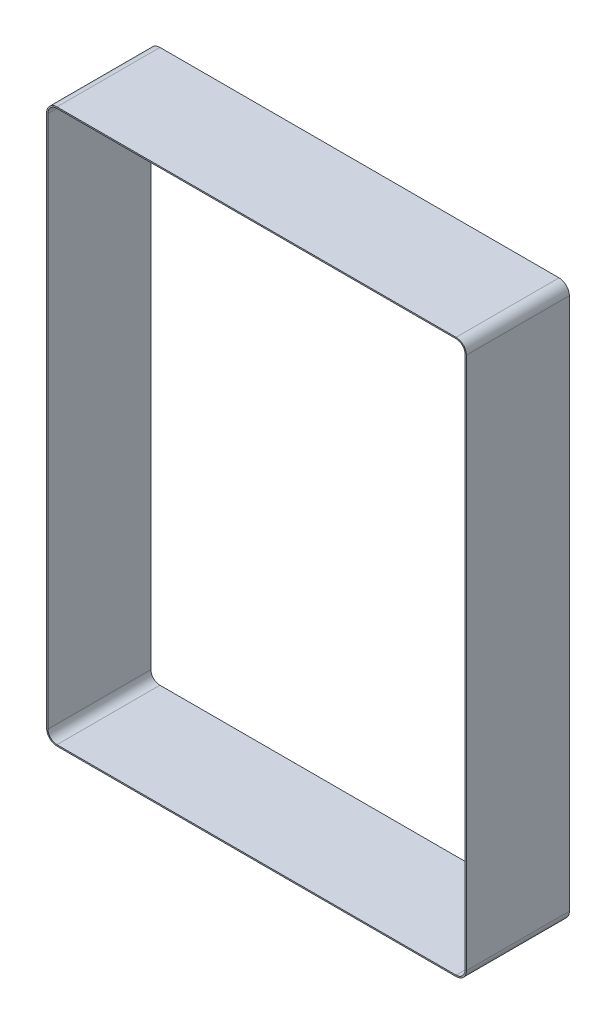
ISO-10303-21;
HEADER;
FILE_DESCRIPTION(('STEP AP214'),'2;1');
FILE_NAME('part.step','',(''),(''),'','','');
FILE_SCHEMA(('AUTOMOTIVE_DESIGN { 1 0 10303 214 1 1 1 1 }'));
ENDSEC;
DATA;
#1=APPLICATION_CONTEXT('core data for automotive mechanical design processes');
#2=APPLICATION_PROTOCOL_DEFINITION('international standard','automotive_design',2000,#1);
#3=PRODUCT_CONTEXT('',#1,'mechanical');
#4=PRODUCT('Part','Part','',(#3));
#5=PRODUCT_RELATED_PRODUCT_CATEGORY('part','',(#4));
#6=PRODUCT_DEFINITION_FORMATION('','',#4);
#7=PRODUCT_DEFINITION_CONTEXT('part definition',#1,'design');
#8=PRODUCT_DEFINITION('design','',#6,#7);
#9=PRODUCT_DEFINITION_SHAPE('','',#8);
#10=(LENGTH_UNIT() NAMED_UNIT(*) SI_UNIT(.MILLI.,.METRE.));
#11=(NAMED_UNIT(*) PLANE_ANGLE_UNIT() SI_UNIT($,.RADIAN.));
#12=(NAMED_UNIT(*) SI_UNIT($,.STERADIAN.) SOLID_ANGLE_UNIT());
#13=UNCERTAINTY_MEASURE_WITH_UNIT(LENGTH_MEASURE(1.E-05),#10,'distance_accuracy_value','');
#14=(GEOMETRIC_REPRESENTATION_CONTEXT(3) GLOBAL_UNCERTAINTY_ASSIGNED_CONTEXT((#13)) GLOBAL_UNIT_ASSIGNED_CONTEXT((#10,
#11,#12)) REPRESENTATION_CONTEXT('',''));
#15=CARTESIAN_POINT('',(0.,0.,0.));
#16=DIRECTION('',(0.,0.,1.));
#17=DIRECTION('',(1.,0.,0.));
#18=AXIS2_PLACEMENT_3D('',#15,#16,#17);
#19=CARTESIAN_POINT('',(-154.999999999862,-26.2767905550758,80.));
#20=DIRECTION('',(0.,0.,-1.));
#21=DIRECTION('',(-1.,0.,0.));
#22=AXIS2_PLACEMENT_3D('',#19,#20,#21);
#23=CYLINDRICAL_SURFACE('',#22,6.99999999999989);
#24=CARTESIAN_POINT('',(-154.999999999862,-26.2767905550758,0.));
#25=DIRECTION('',(0.,0.,1.));
#26=DIRECTION('',(1.,0.,0.));
#27=AXIS2_PLACEMENT_3D('',#24,#25,#26);
#28=CIRCLE('',#27,6.99999999999989);
#29=CARTESIAN_POINT('',(-161.999999999862,-26.2767905550758,0.));
#30=VERTEX_POINT('',#29);
#31=CARTESIAN_POINT('',(-154.999999999862,-33.2767905550757,0.));
#32=VERTEX_POINT('',#31);
#33=EDGE_CURVE('E211',#30,#32,#28,.T.);
#34=ORIENTED_EDGE('',*,*,#33,.F.);
#35=DIRECTION('',(0.,0.,-1.));
#36=VECTOR('',#35,1.);
#37=CARTESIAN_POINT('',(-161.999999999862,-26.2767905550758,80.));
#38=LINE('',#37,#36);
#39=CARTESIAN_POINT('',(-161.999999999862,-26.2767905550758,80.));
#40=VERTEX_POINT('',#39);
#41=EDGE_CURVE('E11',#40,#30,#38,.T.);
#42=ORIENTED_EDGE('',*,*,#41,.F.);
#43=CARTESIAN_POINT('',(-154.999999999862,-26.2767905550758,80.));
#44=DIRECTION('',(0.,0.,1.));
#45=DIRECTION('',(1.,0.,0.));
#46=AXIS2_PLACEMENT_3D('',#43,#44,#45);
#47=CIRCLE('',#46,6.99999999999989);
#48=CARTESIAN_POINT('',(-154.999999999862,-33.2767905550757,80.));
#49=VERTEX_POINT('',#48);
#50=EDGE_CURVE('E303',#40,#49,#47,.T.);
#51=ORIENTED_EDGE('',*,*,#50,.T.);
#52=DIRECTION('',(0.,0.,-1.));
#53=VECTOR('',#52,1.);
#54=CARTESIAN_POINT('',(-154.999999999862,-33.2767905550757,80.));
#55=LINE('',#54,#53);
#56=EDGE_CURVE('E113',#49,#32,#55,.T.);
#57=ORIENTED_EDGE('',*,*,#56,.T.);
#58=EDGE_LOOP('',(#34,#42,#51,#57));
#59=FACE_BOUND('',#58,.T.);
#60=ADVANCED_FACE('F35',(#59),#23,.F.);
#61=CARTESIAN_POINT('',(-161.999999999862,0.,80.));
#62=DIRECTION('',(-1.,0.,0.));
#63=DIRECTION('',(0.,-1.,0.));
#64=AXIS2_PLACEMENT_3D('',#61,#62,#63);
#65=PLANE('',#64);
#66=DIRECTION('',(0.,1.,0.));
#67=VECTOR('',#66,1.);
#68=CARTESIAN_POINT('',(-161.999999999862,0.,0.));
#69=LINE('',#68,#67);
#70=CARTESIAN_POINT('',(-161.999999999862,387.723209444924,0.));
#71=VERTEX_POINT('',#70);
#72=EDGE_CURVE('E213',#30,#71,#69,.T.);
#73=ORIENTED_EDGE('',*,*,#72,.T.);
#74=DIRECTION('',(0.,0.,-1.));
#75=VECTOR('',#74,1.);
#76=CARTESIAN_POINT('',(-161.999999999862,387.723209444924,80.));
#77=LINE('',#76,#75);
#78=CARTESIAN_POINT('',(-161.999999999862,387.723209444924,80.));
#79=VERTEX_POINT('',#78);
#80=EDGE_CURVE('E45',#79,#71,#77,.T.);
#81=ORIENTED_EDGE('',*,*,#80,.F.);
#82=DIRECTION('',(0.,1.,0.));
#83=VECTOR('',#82,1.);
#84=CARTESIAN_POINT('',(-161.999999999862,0.,80.));
#85=LINE('',#84,#83);
#86=EDGE_CURVE('E305',#40,#79,#85,.T.);
#87=ORIENTED_EDGE('',*,*,#86,.F.);
#88=ORIENTED_EDGE('',*,*,#41,.T.);
#89=EDGE_LOOP('',(#73,#81,#87,#88));
#90=FACE_BOUND('',#89,.T.);
#91=ADVANCED_FACE('F332',(#90),#65,.F.);
#92=CARTESIAN_POINT('',(-155.000000000136,387.723209444924,80.));
#93=DIRECTION('',(0.,0.,-1.));
#94=DIRECTION('',(-1.,0.,0.));
#95=AXIS2_PLACEMENT_3D('',#92,#93,#94);
#96=CYLINDRICAL_SURFACE('',#95,6.99999999986282);
#97=CARTESIAN_POINT('',(-155.000000000136,387.723209444924,0.));
#98=DIRECTION('',(0.,0.,1.));
#99=DIRECTION('',(1.,0.,0.));
#100=AXIS2_PLACEMENT_3D('',#97,#98,#99);
#101=CIRCLE('',#100,6.99999999986282);
#102=CARTESIAN_POINT('',(-154.999999999695,394.723209444924,0.));
#103=VERTEX_POINT('',#102);
#104=EDGE_CURVE('E216',#103,#71,#101,.T.);
#105=ORIENTED_EDGE('',*,*,#104,.F.);
#106=DIRECTION('',(0.,0.,-1.));
#107=VECTOR('',#106,1.);
#108=CARTESIAN_POINT('',(-154.999999999695,394.723209444924,80.));
#109=LINE('',#108,#107);
#110=CARTESIAN_POINT('',(-154.999999999695,394.723209444924,80.));
#111=VERTEX_POINT('',#110);
#112=EDGE_CURVE('E235',#111,#103,#109,.T.);
#113=ORIENTED_EDGE('',*,*,#112,.F.);
#114=CARTESIAN_POINT('',(-155.000000000136,387.723209444924,80.));
#115=DIRECTION('',(0.,0.,1.));
#116=DIRECTION('',(1.,0.,0.));
#117=AXIS2_PLACEMENT_3D('',#114,#115,#116);
#118=CIRCLE('',#117,6.99999999986282);
#119=EDGE_CURVE('E307',#111,#79,#118,.T.);
#120=ORIENTED_EDGE('',*,*,#119,.T.);
#121=ORIENTED_EDGE('',*,*,#80,.T.);
#122=EDGE_LOOP('',(#105,#113,#120,#121));
#123=FACE_BOUND('',#122,.T.);
#124=ADVANCED_FACE('F318',(#123),#96,.F.);
#125=CARTESIAN_POINT('',(0.,394.723209444924,80.));
#126=DIRECTION('',(0.,-1.,0.));
#127=DIRECTION('',(1.,0.,0.));
#128=AXIS2_PLACEMENT_3D('',#125,#126,#127);
#129=PLANE('',#128);
#130=DIRECTION('',(-1.,0.,0.));
#131=VECTOR('',#130,1.);
#132=CARTESIAN_POINT('',(0.,394.723209444924,0.));
#133=LINE('',#132,#131);
#134=CARTESIAN_POINT('',(154.999999999694,394.723209444924,0.));
#135=VERTEX_POINT('',#134);
#136=EDGE_CURVE('E219',#135,#103,#133,.T.);
#137=ORIENTED_EDGE('',*,*,#136,.F.);
#138=DIRECTION('',(0.,0.,-1.));
#139=VECTOR('',#138,1.);
#140=CARTESIAN_POINT('',(154.999999999694,394.723209444924,80.));
#141=LINE('',#140,#139);
#142=CARTESIAN_POINT('',(154.999999999694,394.723209444924,80.));
#143=VERTEX_POINT('',#142);
#144=EDGE_CURVE('E233',#143,#135,#141,.T.);
#145=ORIENTED_EDGE('',*,*,#144,.F.);
#146=DIRECTION('',(-1.,0.,0.));
#147=VECTOR('',#146,1.);
#148=CARTESIAN_POINT('',(0.,394.723209444924,80.));
#149=LINE('',#148,#147);
#150=EDGE_CURVE('E182',#143,#111,#149,.T.);
#151=ORIENTED_EDGE('',*,*,#150,.T.);
#152=ORIENTED_EDGE('',*,*,#112,.T.);
#153=EDGE_LOOP('',(#137,#145,#151,#152));
#154=FACE_BOUND('',#153,.T.);
#155=ADVANCED_FACE('F312',(#154),#129,.T.);
#156=CARTESIAN_POINT('',(155.000000000136,387.723209444924,80.));
#157=DIRECTION('',(0.,0.,-1.));
#158=DIRECTION('',(-1.,0.,0.));
#159=AXIS2_PLACEMENT_3D('',#156,#157,#158);
#160=CYLINDRICAL_SURFACE('',#159,6.99999999986282);
#161=CARTESIAN_POINT('',(155.000000000136,387.723209444924,0.));
#162=DIRECTION('',(0.,0.,1.));
#163=DIRECTION('',(1.,0.,0.));
#164=AXIS2_PLACEMENT_3D('',#161,#162,#163);
#165=CIRCLE('',#164,6.99999999986282);
#166=CARTESIAN_POINT('',(161.999999999862,387.723209444924,0.));
#167=VERTEX_POINT('',#166);
#168=EDGE_CURVE('E222',#135,#167,#165,.F.);
#169=ORIENTED_EDGE('',*,*,#168,.T.);
#170=DIRECTION('',(0.,0.,-1.));
#171=VECTOR('',#170,1.);
#172=CARTESIAN_POINT('',(161.999999999862,387.723209444924,80.));
#173=LINE('',#172,#171);
#174=CARTESIAN_POINT('',(161.999999999862,387.723209444924,80.));
#175=VERTEX_POINT('',#174);
#176=EDGE_CURVE('E169',#175,#167,#173,.T.);
#177=ORIENTED_EDGE('',*,*,#176,.F.);
#178=CARTESIAN_POINT('',(155.000000000136,387.723209444924,80.));
#179=DIRECTION('',(0.,0.,1.));
#180=DIRECTION('',(1.,0.,0.));
#181=AXIS2_PLACEMENT_3D('',#178,#179,#180);
#182=CIRCLE('',#181,6.99999999986282);
#183=EDGE_CURVE('E179',#143,#175,#182,.F.);
#184=ORIENTED_EDGE('',*,*,#183,.F.);
#185=ORIENTED_EDGE('',*,*,#144,.T.);
#186=EDGE_LOOP('',(#169,#177,#184,#185));
#187=FACE_BOUND('',#186,.T.);
#188=ADVANCED_FACE('F322',(#187),#160,.F.);
#189=CARTESIAN_POINT('',(161.999999999862,0.,80.));
#190=DIRECTION('',(-1.,0.,0.));
#191=DIRECTION('',(0.,-1.,0.));
#192=AXIS2_PLACEMENT_3D('',#189,#190,#191);
#193=PLANE('',#192);
#194=DIRECTION('',(0.,1.,0.));
#195=VECTOR('',#194,1.);
#196=CARTESIAN_POINT('',(161.999999999862,0.,0.));
#197=LINE('',#196,#195);
#198=CARTESIAN_POINT('',(161.999999999862,-26.2767905550758,0.));
#199=VERTEX_POINT('',#198);
#200=EDGE_CURVE('E166',#199,#167,#197,.T.);
#201=ORIENTED_EDGE('',*,*,#200,.F.);
#202=DIRECTION('',(0.,0.,-1.));
#203=VECTOR('',#202,1.);
#204=CARTESIAN_POINT('',(161.999999999862,-26.2767905550758,80.));
#205=LINE('',#204,#203);
#206=CARTESIAN_POINT('',(161.999999999862,-26.2767905550758,80.));
#207=VERTEX_POINT('',#206);
#208=EDGE_CURVE('E160',#207,#199,#205,.T.);
#209=ORIENTED_EDGE('',*,*,#208,.F.);
#210=DIRECTION('',(0.,1.,0.));
#211=VECTOR('',#210,1.);
#212=CARTESIAN_POINT('',(161.999999999862,0.,80.));
#213=LINE('',#212,#211);
#214=EDGE_CURVE('E164',#207,#175,#213,.T.);
#215=ORIENTED_EDGE('',*,*,#214,.T.);
#216=ORIENTED_EDGE('',*,*,#176,.T.);
#217=EDGE_LOOP('',(#201,#209,#215,#216));
#218=FACE_BOUND('',#217,.T.);
#219=ADVANCED_FACE('F162',(#218),#193,.T.);
#220=CARTESIAN_POINT('',(154.999999999862,-26.2767905550758,80.));
#221=DIRECTION('',(0.,0.,-1.));
#222=DIRECTION('',(-1.,0.,0.));
#223=AXIS2_PLACEMENT_3D('',#220,#221,#222);
#224=CYLINDRICAL_SURFACE('',#223,6.99999999999989);
#225=CARTESIAN_POINT('',(154.999999999862,-26.2767905550758,0.));
#226=DIRECTION('',(0.,0.,1.));
#227=DIRECTION('',(1.,0.,0.));
#228=AXIS2_PLACEMENT_3D('',#225,#226,#227);
#229=CIRCLE('',#228,6.99999999999989);
#230=CARTESIAN_POINT('',(154.999999999862,-33.2767905550757,0.));
#231=VERTEX_POINT('',#230);
#232=EDGE_CURVE('E226',#199,#231,#229,.F.);
#233=ORIENTED_EDGE('',*,*,#232,.T.);
#234=DIRECTION('',(0.,0.,-1.));
#235=VECTOR('',#234,1.);
#236=CARTESIAN_POINT('',(154.999999999862,-33.2767905550757,80.));
#237=LINE('',#236,#235);
#238=CARTESIAN_POINT('',(154.999999999862,-33.2767905550757,80.));
#239=VERTEX_POINT('',#238);
#240=EDGE_CURVE('E170',#239,#231,#237,.T.);
#241=ORIENTED_EDGE('',*,*,#240,.F.);
#242=CARTESIAN_POINT('',(154.999999999862,-26.2767905550758,80.));
#243=DIRECTION('',(0.,0.,1.));
#244=DIRECTION('',(1.,0.,0.));
#245=AXIS2_PLACEMENT_3D('',#242,#243,#244);
#246=CIRCLE('',#245,6.99999999999989);
#247=EDGE_CURVE('E173',#207,#239,#246,.F.);
#248=ORIENTED_EDGE('',*,*,#247,.F.);
#249=ORIENTED_EDGE('',*,*,#208,.T.);
#250=EDGE_LOOP('',(#233,#241,#248,#249));
#251=FACE_BOUND('',#250,.T.);
#252=ADVANCED_FACE('F174',(#251),#224,.F.);
#253=CARTESIAN_POINT('',(154.999999999862,-26.2767905550758,80.));
#254=DIRECTION('',(0.,0.,-1.));
#255=DIRECTION('',(-1.,0.,0.));
#256=AXIS2_PLACEMENT_3D('',#253,#254,#255);
#257=CYLINDRICAL_SURFACE('',#256,7.99999999999989);
#258=CARTESIAN_POINT('',(154.999999999862,-26.2767905550758,0.));
#259=DIRECTION('',(0.,0.,1.));
#260=DIRECTION('',(1.,0.,0.));
#261=AXIS2_PLACEMENT_3D('',#258,#259,#260);
#262=CIRCLE('',#261,7.99999999999989);
#263=CARTESIAN_POINT('',(162.999999999862,-26.2767905550758,0.));
#264=VERTEX_POINT('',#263);
#265=CARTESIAN_POINT('',(154.999999999862,-34.2767905550757,0.));
#266=VERTEX_POINT('',#265);
#267=EDGE_CURVE('E188',#264,#266,#262,.F.);
#268=ORIENTED_EDGE('',*,*,#267,.F.);
#269=DIRECTION('',(0.,0.,-1.));
#270=VECTOR('',#269,1.);
#271=CARTESIAN_POINT('',(162.999999999862,-26.2767905550758,80.));
#272=LINE('',#271,#270);
#273=CARTESIAN_POINT('',(162.999999999862,-26.2767905550758,80.));
#274=VERTEX_POINT('',#273);
#275=EDGE_CURVE('E39',#274,#264,#272,.T.);
#276=ORIENTED_EDGE('',*,*,#275,.F.);
#277=CARTESIAN_POINT('',(154.999999999862,-26.2767905550758,80.));
#278=DIRECTION('',(0.,0.,1.));
#279=DIRECTION('',(1.,0.,0.));
#280=AXIS2_PLACEMENT_3D('',#277,#278,#279);
#281=CIRCLE('',#280,7.99999999999989);
#282=CARTESIAN_POINT('',(154.999999999862,-34.2767905550757,80.));
#283=VERTEX_POINT('',#282);
#284=EDGE_CURVE('E229',#274,#283,#281,.F.);
#285=ORIENTED_EDGE('',*,*,#284,.T.);
#286=DIRECTION('',(0.,0.,-1.));
#287=VECTOR('',#286,1.);
#288=CARTESIAN_POINT('',(154.999999999862,-34.2767905550757,80.));
#289=LINE('',#288,#287);
#290=EDGE_CURVE('E187',#283,#266,#289,.T.);
#291=ORIENTED_EDGE('',*,*,#290,.T.);
#292=EDGE_LOOP('',(#268,#276,#285,#291));
#293=FACE_BOUND('',#292,.T.);
#294=ADVANCED_FACE('F37',(#293),#257,.T.);
#295=CARTESIAN_POINT('',(162.999999999879,-1.07825785337369E-10,80.));
#296=DIRECTION('',(-1.,6.61507885505822E-13,0.));
#297=DIRECTION('',(-6.61507885505822E-13,-1.,0.));
#298=AXIS2_PLACEMENT_3D('',#295,#296,#297);
#299=PLANE('',#298);
#300=DIRECTION('',(6.61507885505822E-13,1.,0.));
#301=VECTOR('',#300,1.);
#302=CARTESIAN_POINT('',(162.999999999879,-1.07825785337369E-10,0.));
#303=LINE('',#302,#301);
#304=CARTESIAN_POINT('',(163.000000000136,387.723209444924,0.));
#305=VERTEX_POINT('',#304);
#306=EDGE_CURVE('E191',#264,#305,#303,.T.);
#307=ORIENTED_EDGE('',*,*,#306,.T.);
#308=DIRECTION('',(0.,0.,-1.));
#309=VECTOR('',#308,1.);
#310=CARTESIAN_POINT('',(163.000000000136,387.723209444924,80.));
#311=LINE('',#310,#309);
#312=CARTESIAN_POINT('',(163.000000000136,387.723209444924,80.));
#313=VERTEX_POINT('',#312);
#314=EDGE_CURVE('E249',#313,#305,#311,.T.);
#315=ORIENTED_EDGE('',*,*,#314,.F.);
#316=DIRECTION('',(6.61507885505822E-13,1.,0.));
#317=VECTOR('',#316,1.);
#318=CARTESIAN_POINT('',(162.999999999879,-1.07825785337369E-10,80.));
#319=LINE('',#318,#317);
#320=EDGE_CURVE('E257',#274,#313,#319,.T.);
#321=ORIENTED_EDGE('',*,*,#320,.F.);
#322=ORIENTED_EDGE('',*,*,#275,.T.);
#323=EDGE_LOOP('',(#307,#315,#321,#322));
#324=FACE_BOUND('',#323,.T.);
#325=ADVANCED_FACE('F256',(#324),#299,.F.);
#326=CARTESIAN_POINT('',(155.000000000136,387.723209444924,80.));
#327=DIRECTION('',(0.,0.,-1.));
#328=DIRECTION('',(-1.,0.,0.));
#329=AXIS2_PLACEMENT_3D('',#326,#327,#328);
#330=CYLINDRICAL_SURFACE('',#329,7.99999999999976);
#331=CARTESIAN_POINT('',(155.000000000136,387.723209444924,0.));
#332=DIRECTION('',(0.,0.,1.));
#333=DIRECTION('',(1.,0.,0.));
#334=AXIS2_PLACEMENT_3D('',#331,#332,#333);
#335=CIRCLE('',#334,7.99999999999976);
#336=CARTESIAN_POINT('',(154.999999999694,395.723209444924,0.));
#337=VERTEX_POINT('',#336);
#338=EDGE_CURVE('E194',#337,#305,#335,.F.);
#339=ORIENTED_EDGE('',*,*,#338,.F.);
#340=DIRECTION('',(0.,0.,-1.));
#341=VECTOR('',#340,1.);
#342=CARTESIAN_POINT('',(154.999999999694,395.723209444924,80.));
#343=LINE('',#342,#341);
#344=CARTESIAN_POINT('',(154.999999999694,395.723209444924,80.));
#345=VERTEX_POINT('',#344);
#346=EDGE_CURVE('E248',#345,#337,#343,.T.);
#347=ORIENTED_EDGE('',*,*,#346,.F.);
#348=CARTESIAN_POINT('',(155.000000000136,387.723209444924,80.));
#349=DIRECTION('',(0.,0.,1.));
#350=DIRECTION('',(1.,0.,0.));
#351=AXIS2_PLACEMENT_3D('',#348,#349,#350);
#352=CIRCLE('',#351,7.99999999999976);
#353=EDGE_CURVE('E288',#345,#313,#352,.F.);
#354=ORIENTED_EDGE('',*,*,#353,.T.);
#355=ORIENTED_EDGE('',*,*,#314,.T.);
#356=EDGE_LOOP('',(#339,#347,#354,#355));
#357=FACE_BOUND('',#356,.T.);
#358=ADVANCED_FACE('F285',(#357),#330,.T.);
#359=CARTESIAN_POINT('',(0.,395.723209444924,80.));
#360=DIRECTION('',(0.,-1.,0.));
#361=DIRECTION('',(0.,0.,-1.));
#362=AXIS2_PLACEMENT_3D('',#359,#360,#361);
#363=PLANE('',#362);
#364=DIRECTION('',(-1.,0.,0.));
#365=VECTOR('',#364,1.);
#366=CARTESIAN_POINT('',(0.,395.723209444924,0.));
#367=LINE('',#366,#365);
#368=CARTESIAN_POINT('',(-154.999999999631,395.723209444924,0.));
#369=VERTEX_POINT('',#368);
#370=EDGE_CURVE('E197',#337,#369,#367,.T.);
#371=ORIENTED_EDGE('',*,*,#370,.T.);
#372=DIRECTION('',(0.,0.,-1.));
#373=VECTOR('',#372,1.);
#374=CARTESIAN_POINT('',(-154.999999999631,395.723209444924,80.));
#375=LINE('',#374,#373);
#376=CARTESIAN_POINT('',(-154.999999999631,395.723209444924,80.));
#377=VERTEX_POINT('',#376);
#378=EDGE_CURVE('E245',#377,#369,#375,.T.);
#379=ORIENTED_EDGE('',*,*,#378,.F.);
#380=DIRECTION('',(-1.,0.,0.));
#381=VECTOR('',#380,1.);
#382=CARTESIAN_POINT('',(0.,395.723209444924,80.));
#383=LINE('',#382,#381);
#384=EDGE_CURVE('E289',#345,#377,#383,.T.);
#385=ORIENTED_EDGE('',*,*,#384,.F.);
#386=ORIENTED_EDGE('',*,*,#346,.T.);
#387=EDGE_LOOP('',(#371,#379,#385,#386));
#388=FACE_BOUND('',#387,.T.);
#389=ADVANCED_FACE('F290',(#388),#363,.F.);
#390=CARTESIAN_POINT('',(-155.000000000136,387.723209444924,80.));
#391=DIRECTION('',(0.,0.,-1.));
#392=DIRECTION('',(-1.,0.,0.));
#393=AXIS2_PLACEMENT_3D('',#390,#391,#392);
#394=CYLINDRICAL_SURFACE('',#393,7.99999999986281);
#395=CARTESIAN_POINT('',(-155.000000000136,387.723209444924,0.));
#396=DIRECTION('',(0.,0.,1.));
#397=DIRECTION('',(1.,0.,0.));
#398=AXIS2_PLACEMENT_3D('',#395,#396,#397);
#399=CIRCLE('',#398,7.99999999986281);
#400=CARTESIAN_POINT('',(-162.999999999862,387.723209444924,0.));
#401=VERTEX_POINT('',#400);
#402=EDGE_CURVE('E199',#369,#401,#399,.T.);
#403=ORIENTED_EDGE('',*,*,#402,.T.);
#404=DIRECTION('',(0.,0.,-1.));
#405=VECTOR('',#404,1.);
#406=CARTESIAN_POINT('',(-162.999999999862,387.723209444924,80.));
#407=LINE('',#406,#405);
#408=CARTESIAN_POINT('',(-162.999999999862,387.723209444924,80.));
#409=VERTEX_POINT('',#408);
#410=EDGE_CURVE('E243',#409,#401,#407,.T.);
#411=ORIENTED_EDGE('',*,*,#410,.F.);
#412=CARTESIAN_POINT('',(-155.000000000136,387.723209444924,80.));
#413=DIRECTION('',(0.,0.,1.));
#414=DIRECTION('',(1.,0.,0.));
#415=AXIS2_PLACEMENT_3D('',#412,#413,#414);
#416=CIRCLE('',#415,7.99999999986281);
#417=EDGE_CURVE('E292',#377,#409,#416,.T.);
#418=ORIENTED_EDGE('',*,*,#417,.F.);
#419=ORIENTED_EDGE('',*,*,#378,.T.);
#420=EDGE_LOOP('',(#403,#411,#418,#419));
#421=FACE_BOUND('',#420,.T.);
#422=ADVANCED_FACE('F282',(#421),#394,.T.);
#423=CARTESIAN_POINT('',(-162.999999999862,0.,80.));
#424=DIRECTION('',(-1.,0.,0.));
#425=DIRECTION('',(0.,-1.,0.));
#426=AXIS2_PLACEMENT_3D('',#423,#424,#425);
#427=PLANE('',#426);
#428=DIRECTION('',(0.,1.,0.));
#429=VECTOR('',#428,1.);
#430=CARTESIAN_POINT('',(-162.999999999862,0.,0.));
#431=LINE('',#430,#429);
#432=CARTESIAN_POINT('',(-162.999999999862,-26.2767905550758,0.));
#433=VERTEX_POINT('',#432);
#434=EDGE_CURVE('E202',#433,#401,#431,.T.);
#435=ORIENTED_EDGE('',*,*,#434,.F.);
#436=DIRECTION('',(0.,0.,-1.));
#437=VECTOR('',#436,1.);
#438=CARTESIAN_POINT('',(-162.999999999862,-26.2767905550758,80.));
#439=LINE('',#438,#437);
#440=CARTESIAN_POINT('',(-162.999999999862,-26.2767905550758,80.));
#441=VERTEX_POINT('',#440);
#442=EDGE_CURVE('E241',#441,#433,#439,.T.);
#443=ORIENTED_EDGE('',*,*,#442,.F.);
#444=DIRECTION('',(0.,1.,0.));
#445=VECTOR('',#444,1.);
#446=CARTESIAN_POINT('',(-162.999999999862,0.,80.));
#447=LINE('',#446,#445);
#448=EDGE_CURVE('E279',#441,#409,#447,.T.);
#449=ORIENTED_EDGE('',*,*,#448,.T.);
#450=ORIENTED_EDGE('',*,*,#410,.T.);
#451=EDGE_LOOP('',(#435,#443,#449,#450));
#452=FACE_BOUND('',#451,.T.);
#453=ADVANCED_FACE('F274',(#452),#427,.T.);
#454=CARTESIAN_POINT('',(-154.999999999862,-26.2767905550758,80.));
#455=DIRECTION('',(0.,0.,-1.));
#456=DIRECTION('',(-1.,0.,0.));
#457=AXIS2_PLACEMENT_3D('',#454,#455,#456);
#458=CYLINDRICAL_SURFACE('',#457,7.99999999999989);
#459=CARTESIAN_POINT('',(-154.999999999862,-26.2767905550758,0.));
#460=DIRECTION('',(0.,0.,1.));
#461=DIRECTION('',(1.,0.,0.));
#462=AXIS2_PLACEMENT_3D('',#459,#460,#461);
#463=CIRCLE('',#462,7.99999999999989);
#464=CARTESIAN_POINT('',(-154.999999999862,-34.2767905550757,0.));
#465=VERTEX_POINT('',#464);
#466=EDGE_CURVE('E205',#433,#465,#463,.T.);
#467=ORIENTED_EDGE('',*,*,#466,.T.);
#468=DIRECTION('',(0.,0.,-1.));
#469=VECTOR('',#468,1.);
#470=CARTESIAN_POINT('',(-154.999999999862,-34.2767905550757,80.));
#471=LINE('',#470,#469);
#472=CARTESIAN_POINT('',(-154.999999999862,-34.2767905550757,80.));
#473=VERTEX_POINT('',#472);
#474=EDGE_CURVE('E239',#473,#465,#471,.T.);
#475=ORIENTED_EDGE('',*,*,#474,.F.);
#476=CARTESIAN_POINT('',(-154.999999999862,-26.2767905550758,80.));
#477=DIRECTION('',(0.,0.,1.));
#478=DIRECTION('',(1.,0.,0.));
#479=AXIS2_PLACEMENT_3D('',#476,#477,#478);
#480=CIRCLE('',#479,7.99999999999989);
#481=EDGE_CURVE('E300',#441,#473,#480,.T.);
#482=ORIENTED_EDGE('',*,*,#481,.F.);
#483=ORIENTED_EDGE('',*,*,#442,.T.);
#484=EDGE_LOOP('',(#467,#475,#482,#483));
#485=FACE_BOUND('',#484,.T.);
#486=ADVANCED_FACE('F344',(#485),#458,.T.);
#487=CARTESIAN_POINT('',(0.,-34.2767905550757,80.));
#488=DIRECTION('',(0.,-1.,0.));
#489=DIRECTION('',(1.,0.,0.));
#490=AXIS2_PLACEMENT_3D('',#487,#488,#489);
#491=PLANE('',#490);
#492=DIRECTION('',(-1.,0.,0.));
#493=VECTOR('',#492,1.);
#494=CARTESIAN_POINT('',(0.,-34.2767905550757,0.));
#495=LINE('',#494,#493);
#496=EDGE_CURVE('E208',#266,#465,#495,.T.);
#497=ORIENTED_EDGE('',*,*,#496,.F.);
#498=ORIENTED_EDGE('',*,*,#290,.F.);
#499=DIRECTION('',(-1.,0.,0.));
#500=VECTOR('',#499,1.);
#501=CARTESIAN_POINT('',(0.,-34.2767905550757,80.));
#502=LINE('',#501,#500);
#503=EDGE_CURVE('E267',#283,#473,#502,.T.);
#504=ORIENTED_EDGE('',*,*,#503,.T.);
#505=ORIENTED_EDGE('',*,*,#474,.T.);
#506=EDGE_LOOP('',(#497,#498,#504,#505));
#507=FACE_BOUND('',#506,.T.);
#508=ADVANCED_FACE('F266',(#507),#491,.T.);
#509=CARTESIAN_POINT('',(0.,-33.2767905550757,80.));
#510=DIRECTION('',(0.,-1.,0.));
#511=DIRECTION('',(1.,0.,0.));
#512=AXIS2_PLACEMENT_3D('',#509,#510,#511);
#513=PLANE('',#512);
#514=DIRECTION('',(-1.,0.,0.));
#515=VECTOR('',#514,1.);
#516=CARTESIAN_POINT('',(0.,-33.2767905550757,0.));
#517=LINE('',#516,#515);
#518=EDGE_CURVE('E106',#231,#32,#517,.T.);
#519=ORIENTED_EDGE('',*,*,#518,.T.);
#520=ORIENTED_EDGE('',*,*,#56,.F.);
#521=DIRECTION('',(-1.,0.,0.));
#522=VECTOR('',#521,1.);
#523=CARTESIAN_POINT('',(0.,-33.2767905550757,80.));
#524=LINE('',#523,#522);
#525=EDGE_CURVE('E54',#239,#49,#524,.T.);
#526=ORIENTED_EDGE('',*,*,#525,.F.);
#527=ORIENTED_EDGE('',*,*,#240,.T.);
#528=EDGE_LOOP('',(#519,#520,#526,#527));
#529=FACE_BOUND('',#528,.T.);
#530=ADVANCED_FACE('F343',(#529),#513,.F.);
#531=CARTESIAN_POINT('',(0.,0.,80.));
#532=DIRECTION('',(0.,0.,1.));
#533=DIRECTION('',(1.,0.,0.));
#534=AXIS2_PLACEMENT_3D('',#531,#532,#533);
#535=PLANE('',#534);
#536=ORIENTED_EDGE('',*,*,#284,.F.);
#537=ORIENTED_EDGE('',*,*,#320,.T.);
#538=ORIENTED_EDGE('',*,*,#353,.F.);
#539=ORIENTED_EDGE('',*,*,#384,.T.);
#540=ORIENTED_EDGE('',*,*,#417,.T.);
#541=ORIENTED_EDGE('',*,*,#448,.F.);
#542=ORIENTED_EDGE('',*,*,#481,.T.);
#543=ORIENTED_EDGE('',*,*,#503,.F.);
#544=EDGE_LOOP('',(#536,#537,#538,#539,#540,#541,#542,#543));
#545=FACE_BOUND('',#544,.T.);
#546=ORIENTED_EDGE('',*,*,#50,.F.);
#547=ORIENTED_EDGE('',*,*,#86,.T.);
#548=ORIENTED_EDGE('',*,*,#119,.F.);
#549=ORIENTED_EDGE('',*,*,#150,.F.);
#550=ORIENTED_EDGE('',*,*,#183,.T.);
#551=ORIENTED_EDGE('',*,*,#214,.F.);
#552=ORIENTED_EDGE('',*,*,#247,.T.);
#553=ORIENTED_EDGE('',*,*,#525,.T.);
#554=EDGE_LOOP('',(#546,#547,#548,#549,#550,#551,#552,#553));
#555=FACE_BOUND('',#554,.T.);
#556=ADVANCED_FACE('F176',(#545,#555),#535,.T.);
#557=CARTESIAN_POINT('',(0.,0.,0.));
#558=DIRECTION('',(0.,0.,1.));
#559=DIRECTION('',(1.,0.,0.));
#560=AXIS2_PLACEMENT_3D('',#557,#558,#559);
#561=PLANE('',#560);
#562=ORIENTED_EDGE('',*,*,#267,.T.);
#563=ORIENTED_EDGE('',*,*,#496,.T.);
#564=ORIENTED_EDGE('',*,*,#466,.F.);
#565=ORIENTED_EDGE('',*,*,#434,.T.);
#566=ORIENTED_EDGE('',*,*,#402,.F.);
#567=ORIENTED_EDGE('',*,*,#370,.F.);
#568=ORIENTED_EDGE('',*,*,#338,.T.);
#569=ORIENTED_EDGE('',*,*,#306,.F.);
#570=EDGE_LOOP('',(#562,#563,#564,#565,#566,#567,#568,#569));
#571=FACE_BOUND('',#570,.T.);
#572=ORIENTED_EDGE('',*,*,#33,.T.);
#573=ORIENTED_EDGE('',*,*,#518,.F.);
#574=ORIENTED_EDGE('',*,*,#232,.F.);
#575=ORIENTED_EDGE('',*,*,#200,.T.);
#576=ORIENTED_EDGE('',*,*,#168,.F.);
#577=ORIENTED_EDGE('',*,*,#136,.T.);
#578=ORIENTED_EDGE('',*,*,#104,.T.);
#579=ORIENTED_EDGE('',*,*,#72,.F.);
#580=EDGE_LOOP('',(#572,#573,#574,#575,#576,#577,#578,#579));
#581=FACE_BOUND('',#580,.T.);
#582=ADVANCED_FACE('F260',(#571,#581),#561,.F.);
#583=CLOSED_SHELL('',(#60,#91,#124,#155,#188,#219,#252,#294,#325,#358,#389,#422,#453,#486,#508,
#530,#556,#582));
#584=MANIFOLD_SOLID_BREP('B2',#583);
#585=ADVANCED_BREP_SHAPE_REPRESENTATION('',(#18,#584),#14);
#586=SHAPE_DEFINITION_REPRESENTATION(#9,#585);
ENDSEC;
END-ISO-10303-21;
